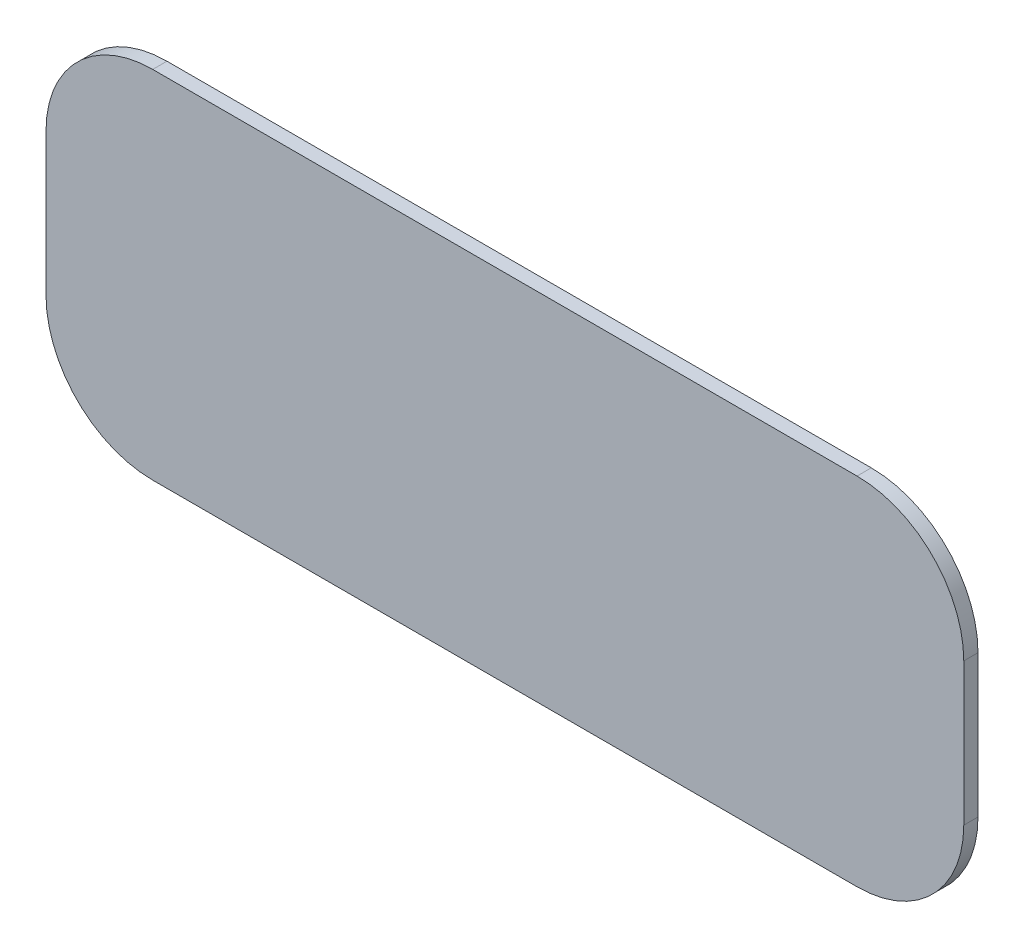
ISO-10303-21;
HEADER;
FILE_DESCRIPTION(('STEP AP214'),'2;1');
FILE_NAME('part.step','',(''),(''),'','','');
FILE_SCHEMA(('AUTOMOTIVE_DESIGN { 1 0 10303 214 1 1 1 1 }'));
ENDSEC;
DATA;
#1=APPLICATION_CONTEXT('core data for automotive mechanical design processes');
#2=APPLICATION_PROTOCOL_DEFINITION('international standard','automotive_design',2000,#1);
#3=PRODUCT_CONTEXT('',#1,'mechanical');
#4=PRODUCT('Part','Part','',(#3));
#5=PRODUCT_RELATED_PRODUCT_CATEGORY('part','',(#4));
#6=PRODUCT_DEFINITION_FORMATION('','',#4);
#7=PRODUCT_DEFINITION_CONTEXT('part definition',#1,'design');
#8=PRODUCT_DEFINITION('design','',#6,#7);
#9=PRODUCT_DEFINITION_SHAPE('','',#8);
#10=(LENGTH_UNIT() NAMED_UNIT(*) SI_UNIT(.MILLI.,.METRE.));
#11=(NAMED_UNIT(*) PLANE_ANGLE_UNIT() SI_UNIT($,.RADIAN.));
#12=(NAMED_UNIT(*) SI_UNIT($,.STERADIAN.) SOLID_ANGLE_UNIT());
#13=UNCERTAINTY_MEASURE_WITH_UNIT(LENGTH_MEASURE(1.E-05),#10,'distance_accuracy_value','');
#14=(GEOMETRIC_REPRESENTATION_CONTEXT(3) GLOBAL_UNCERTAINTY_ASSIGNED_CONTEXT((#13)) GLOBAL_UNIT_ASSIGNED_CONTEXT((#10,
#11,#12)) REPRESENTATION_CONTEXT('',''));
#15=CARTESIAN_POINT('',(0.,0.,0.));
#16=DIRECTION('',(0.,0.,1.));
#17=DIRECTION('',(1.,0.,0.));
#18=AXIS2_PLACEMENT_3D('',#15,#16,#17);
#19=CARTESIAN_POINT('',(0.,0.,2.));
#20=DIRECTION('',(-1.,0.,0.));
#21=DIRECTION('',(0.,-1.,0.));
#22=AXIS2_PLACEMENT_3D('',#19,#20,#21);
#23=PLANE('',#22);
#24=DIRECTION('',(0.,1.,0.));
#25=VECTOR('',#24,1.);
#26=CARTESIAN_POINT('',(0.,0.,2.));
#27=LINE('',#26,#25);
#28=CARTESIAN_POINT('',(0.,15.,2.));
#29=VERTEX_POINT('',#28);
#30=CARTESIAN_POINT('',(0.,35.,2.));
#31=VERTEX_POINT('',#30);
#32=EDGE_CURVE('E128',#29,#31,#27,.T.);
#33=ORIENTED_EDGE('',*,*,#32,.F.);
#34=DIRECTION('',(0.,0.,-1.));
#35=VECTOR('',#34,1.);
#36=CARTESIAN_POINT('',(0.,15.,2.));
#37=LINE('',#36,#35);
#38=CARTESIAN_POINT('',(0.,15.,0.));
#39=VERTEX_POINT('',#38);
#40=EDGE_CURVE('E154',#29,#39,#37,.T.);
#41=ORIENTED_EDGE('',*,*,#40,.T.);
#42=DIRECTION('',(0.,1.,0.));
#43=VECTOR('',#42,1.);
#44=CARTESIAN_POINT('',(0.,0.,0.));
#45=LINE('',#44,#43);
#46=CARTESIAN_POINT('',(0.,35.,0.));
#47=VERTEX_POINT('',#46);
#48=EDGE_CURVE('E160',#39,#47,#45,.T.);
#49=ORIENTED_EDGE('',*,*,#48,.T.);
#50=DIRECTION('',(0.,0.,-1.));
#51=VECTOR('',#50,1.);
#52=CARTESIAN_POINT('',(0.,35.,2.));
#53=LINE('',#52,#51);
#54=EDGE_CURVE('E152',#47,#31,#53,.F.);
#55=ORIENTED_EDGE('',*,*,#54,.T.);
#56=EDGE_LOOP('',(#33,#41,#49,#55));
#57=FACE_BOUND('',#56,.T.);
#58=ADVANCED_FACE('F36',(#57),#23,.F.);
#59=CARTESIAN_POINT('',(0.,50.,2.));
#60=DIRECTION('',(0.,-1.,0.));
#61=DIRECTION('',(1.,0.,0.));
#62=AXIS2_PLACEMENT_3D('',#59,#60,#61);
#63=PLANE('',#62);
#64=DIRECTION('',(-1.,0.,0.));
#65=VECTOR('',#64,1.);
#66=CARTESIAN_POINT('',(0.,50.,2.));
#67=LINE('',#66,#65);
#68=CARTESIAN_POINT('',(-15.,50.,2.));
#69=VERTEX_POINT('',#68);
#70=CARTESIAN_POINT('',(-114.,50.,2.));
#71=VERTEX_POINT('',#70);
#72=EDGE_CURVE('E131',#69,#71,#67,.T.);
#73=ORIENTED_EDGE('',*,*,#72,.F.);
#74=DIRECTION('',(0.,0.,-1.));
#75=VECTOR('',#74,1.);
#76=CARTESIAN_POINT('',(-15.,50.,2.));
#77=LINE('',#76,#75);
#78=CARTESIAN_POINT('',(-15.,50.,0.));
#79=VERTEX_POINT('',#78);
#80=EDGE_CURVE('E11',#69,#79,#77,.T.);
#81=ORIENTED_EDGE('',*,*,#80,.T.);
#82=DIRECTION('',(-1.,0.,0.));
#83=VECTOR('',#82,1.);
#84=CARTESIAN_POINT('',(0.,50.,0.));
#85=LINE('',#84,#83);
#86=CARTESIAN_POINT('',(-114.,50.,0.));
#87=VERTEX_POINT('',#86);
#88=EDGE_CURVE('E133',#79,#87,#85,.T.);
#89=ORIENTED_EDGE('',*,*,#88,.T.);
#90=DIRECTION('',(0.,0.,-1.));
#91=VECTOR('',#90,1.);
#92=CARTESIAN_POINT('',(-114.,50.,2.));
#93=LINE('',#92,#91);
#94=EDGE_CURVE('E44',#87,#71,#93,.F.);
#95=ORIENTED_EDGE('',*,*,#94,.T.);
#96=EDGE_LOOP('',(#73,#81,#89,#95));
#97=FACE_BOUND('',#96,.T.);
#98=ADVANCED_FACE('F179',(#97),#63,.F.);
#99=CARTESIAN_POINT('',(-129.,0.,2.));
#100=DIRECTION('',(1.,0.,0.));
#101=DIRECTION('',(0.,0.,-1.));
#102=AXIS2_PLACEMENT_3D('',#99,#100,#101);
#103=PLANE('',#102);
#104=DIRECTION('',(0.,-1.,0.));
#105=VECTOR('',#104,1.);
#106=CARTESIAN_POINT('',(-129.,0.,0.));
#107=LINE('',#106,#105);
#108=CARTESIAN_POINT('',(-129.,35.,0.));
#109=VERTEX_POINT('',#108);
#110=CARTESIAN_POINT('',(-129.,15.,0.));
#111=VERTEX_POINT('',#110);
#112=EDGE_CURVE('E129',#109,#111,#107,.T.);
#113=ORIENTED_EDGE('',*,*,#112,.T.);
#114=DIRECTION('',(0.,0.,-1.));
#115=VECTOR('',#114,1.);
#116=CARTESIAN_POINT('',(-129.,15.,2.));
#117=LINE('',#116,#115);
#118=CARTESIAN_POINT('',(-129.,15.,2.));
#119=VERTEX_POINT('',#118);
#120=EDGE_CURVE('E107',#111,#119,#117,.F.);
#121=ORIENTED_EDGE('',*,*,#120,.T.);
#122=DIRECTION('',(0.,-1.,0.));
#123=VECTOR('',#122,1.);
#124=CARTESIAN_POINT('',(-129.,0.,2.));
#125=LINE('',#124,#123);
#126=CARTESIAN_POINT('',(-129.,35.,2.));
#127=VERTEX_POINT('',#126);
#128=EDGE_CURVE('E168',#127,#119,#125,.T.);
#129=ORIENTED_EDGE('',*,*,#128,.F.);
#130=DIRECTION('',(0.,0.,-1.));
#131=VECTOR('',#130,1.);
#132=CARTESIAN_POINT('',(-129.,35.,2.));
#133=LINE('',#132,#131);
#134=EDGE_CURVE('E112',#127,#109,#133,.T.);
#135=ORIENTED_EDGE('',*,*,#134,.T.);
#136=EDGE_LOOP('',(#113,#121,#129,#135));
#137=FACE_BOUND('',#136,.T.);
#138=ADVANCED_FACE('F178',(#137),#103,.F.);
#139=CARTESIAN_POINT('',(0.,0.,2.));
#140=DIRECTION('',(0.,1.,0.));
#141=DIRECTION('',(0.,0.,1.));
#142=AXIS2_PLACEMENT_3D('',#139,#140,#141);
#143=PLANE('',#142);
#144=DIRECTION('',(1.,0.,0.));
#145=VECTOR('',#144,1.);
#146=CARTESIAN_POINT('',(0.,0.,2.));
#147=LINE('',#146,#145);
#148=CARTESIAN_POINT('',(-114.,0.,2.));
#149=VERTEX_POINT('',#148);
#150=CARTESIAN_POINT('',(-15.,0.,2.));
#151=VERTEX_POINT('',#150);
#152=EDGE_CURVE('E122',#149,#151,#147,.T.);
#153=ORIENTED_EDGE('',*,*,#152,.F.);
#154=DIRECTION('',(0.,0.,-1.));
#155=VECTOR('',#154,1.);
#156=CARTESIAN_POINT('',(-114.,0.,2.));
#157=LINE('',#156,#155);
#158=CARTESIAN_POINT('',(-114.,0.,0.));
#159=VERTEX_POINT('',#158);
#160=EDGE_CURVE('E106',#149,#159,#157,.T.);
#161=ORIENTED_EDGE('',*,*,#160,.T.);
#162=DIRECTION('',(1.,0.,0.));
#163=VECTOR('',#162,1.);
#164=CARTESIAN_POINT('',(0.,0.,0.));
#165=LINE('',#164,#163);
#166=CARTESIAN_POINT('',(-15.,0.,0.));
#167=VERTEX_POINT('',#166);
#168=EDGE_CURVE('E119',#159,#167,#165,.T.);
#169=ORIENTED_EDGE('',*,*,#168,.T.);
#170=DIRECTION('',(0.,0.,-1.));
#171=VECTOR('',#170,1.);
#172=CARTESIAN_POINT('',(-15.,0.,2.));
#173=LINE('',#172,#171);
#174=EDGE_CURVE('E124',#167,#151,#173,.F.);
#175=ORIENTED_EDGE('',*,*,#174,.T.);
#176=EDGE_LOOP('',(#153,#161,#169,#175));
#177=FACE_BOUND('',#176,.T.);
#178=ADVANCED_FACE('F118',(#177),#143,.F.);
#179=CARTESIAN_POINT('',(0.,0.,2.));
#180=DIRECTION('',(0.,0.,1.));
#181=DIRECTION('',(1.,0.,0.));
#182=AXIS2_PLACEMENT_3D('',#179,#180,#181);
#183=PLANE('',#182);
#184=ORIENTED_EDGE('',*,*,#128,.T.);
#185=CARTESIAN_POINT('',(-114.,15.,2.));
#186=DIRECTION('',(0.,0.,1.));
#187=DIRECTION('',(1.,0.,0.));
#188=AXIS2_PLACEMENT_3D('',#185,#186,#187);
#189=CIRCLE('',#188,15.);
#190=EDGE_CURVE('E150',#119,#149,#189,.T.);
#191=ORIENTED_EDGE('',*,*,#190,.T.);
#192=ORIENTED_EDGE('',*,*,#152,.T.);
#193=CARTESIAN_POINT('',(-15.,15.,2.));
#194=DIRECTION('',(0.,0.,1.));
#195=DIRECTION('',(1.,0.,0.));
#196=AXIS2_PLACEMENT_3D('',#193,#194,#195);
#197=CIRCLE('',#196,15.);
#198=EDGE_CURVE('E148',#151,#29,#197,.T.);
#199=ORIENTED_EDGE('',*,*,#198,.T.);
#200=ORIENTED_EDGE('',*,*,#32,.T.);
#201=CARTESIAN_POINT('',(-15.,35.,2.));
#202=DIRECTION('',(0.,0.,1.));
#203=DIRECTION('',(1.,0.,0.));
#204=AXIS2_PLACEMENT_3D('',#201,#202,#203);
#205=CIRCLE('',#204,15.);
#206=EDGE_CURVE('E57',#31,#69,#205,.T.);
#207=ORIENTED_EDGE('',*,*,#206,.T.);
#208=ORIENTED_EDGE('',*,*,#72,.T.);
#209=CARTESIAN_POINT('',(-114.,35.,2.));
#210=DIRECTION('',(0.,0.,1.));
#211=DIRECTION('',(1.,0.,0.));
#212=AXIS2_PLACEMENT_3D('',#209,#210,#211);
#213=CIRCLE('',#212,15.);
#214=EDGE_CURVE('E145',#71,#127,#213,.T.);
#215=ORIENTED_EDGE('',*,*,#214,.T.);
#216=EDGE_LOOP('',(#184,#191,#192,#199,#200,#207,#208,#215));
#217=FACE_BOUND('',#216,.T.);
#218=ADVANCED_FACE('F172',(#217),#183,.T.);
#219=CARTESIAN_POINT('',(0.,0.,0.));
#220=DIRECTION('',(0.,0.,1.));
#221=DIRECTION('',(1.,0.,0.));
#222=AXIS2_PLACEMENT_3D('',#219,#220,#221);
#223=PLANE('',#222);
#224=ORIENTED_EDGE('',*,*,#168,.F.);
#225=CARTESIAN_POINT('',(-114.,15.,0.));
#226=DIRECTION('',(0.,0.,1.));
#227=DIRECTION('',(1.,0.,0.));
#228=AXIS2_PLACEMENT_3D('',#225,#226,#227);
#229=CIRCLE('',#228,15.);
#230=EDGE_CURVE('E102',#159,#111,#229,.F.);
#231=ORIENTED_EDGE('',*,*,#230,.T.);
#232=ORIENTED_EDGE('',*,*,#112,.F.);
#233=CARTESIAN_POINT('',(-114.,35.,0.));
#234=DIRECTION('',(0.,0.,1.));
#235=DIRECTION('',(1.,0.,0.));
#236=AXIS2_PLACEMENT_3D('',#233,#234,#235);
#237=CIRCLE('',#236,15.);
#238=EDGE_CURVE('E123',#109,#87,#237,.F.);
#239=ORIENTED_EDGE('',*,*,#238,.T.);
#240=ORIENTED_EDGE('',*,*,#88,.F.);
#241=CARTESIAN_POINT('',(-15.,35.,0.));
#242=DIRECTION('',(0.,0.,1.));
#243=DIRECTION('',(1.,0.,0.));
#244=AXIS2_PLACEMENT_3D('',#241,#242,#243);
#245=CIRCLE('',#244,15.);
#246=EDGE_CURVE('E139',#79,#47,#245,.F.);
#247=ORIENTED_EDGE('',*,*,#246,.T.);
#248=ORIENTED_EDGE('',*,*,#48,.F.);
#249=CARTESIAN_POINT('',(-15.,15.,0.));
#250=DIRECTION('',(0.,0.,1.));
#251=DIRECTION('',(1.,0.,0.));
#252=AXIS2_PLACEMENT_3D('',#249,#250,#251);
#253=CIRCLE('',#252,15.);
#254=EDGE_CURVE('E113',#39,#167,#253,.F.);
#255=ORIENTED_EDGE('',*,*,#254,.T.);
#256=EDGE_LOOP('',(#224,#231,#232,#239,#240,#247,#248,#255));
#257=FACE_BOUND('',#256,.T.);
#258=ADVANCED_FACE('F126',(#257),#223,.F.);
#259=CARTESIAN_POINT('',(-114.,15.,2.));
#260=DIRECTION('',(0.,0.,-1.));
#261=DIRECTION('',(-1.,0.,0.));
#262=AXIS2_PLACEMENT_3D('',#259,#260,#261);
#263=CYLINDRICAL_SURFACE('',#262,15.);
#264=ORIENTED_EDGE('',*,*,#190,.F.);
#265=ORIENTED_EDGE('',*,*,#120,.F.);
#266=ORIENTED_EDGE('',*,*,#230,.F.);
#267=ORIENTED_EDGE('',*,*,#160,.F.);
#268=EDGE_LOOP('',(#264,#265,#266,#267));
#269=FACE_BOUND('',#268,.T.);
#270=ADVANCED_FACE('F105',(#269),#263,.T.);
#271=CARTESIAN_POINT('',(-15.,15.,2.));
#272=DIRECTION('',(0.,0.,-1.));
#273=DIRECTION('',(-1.,0.,0.));
#274=AXIS2_PLACEMENT_3D('',#271,#272,#273);
#275=CYLINDRICAL_SURFACE('',#274,15.);
#276=ORIENTED_EDGE('',*,*,#198,.F.);
#277=ORIENTED_EDGE('',*,*,#174,.F.);
#278=ORIENTED_EDGE('',*,*,#254,.F.);
#279=ORIENTED_EDGE('',*,*,#40,.F.);
#280=EDGE_LOOP('',(#276,#277,#278,#279));
#281=FACE_BOUND('',#280,.T.);
#282=ADVANCED_FACE('F182',(#281),#275,.T.);
#283=CARTESIAN_POINT('',(-15.,35.,2.));
#284=DIRECTION('',(0.,0.,-1.));
#285=DIRECTION('',(-1.,0.,0.));
#286=AXIS2_PLACEMENT_3D('',#283,#284,#285);
#287=CYLINDRICAL_SURFACE('',#286,15.);
#288=ORIENTED_EDGE('',*,*,#206,.F.);
#289=ORIENTED_EDGE('',*,*,#54,.F.);
#290=ORIENTED_EDGE('',*,*,#246,.F.);
#291=ORIENTED_EDGE('',*,*,#80,.F.);
#292=EDGE_LOOP('',(#288,#289,#290,#291));
#293=FACE_BOUND('',#292,.T.);
#294=ADVANCED_FACE('F181',(#293),#287,.T.);
#295=CARTESIAN_POINT('',(-114.,35.,2.));
#296=DIRECTION('',(0.,0.,-1.));
#297=DIRECTION('',(-1.,0.,0.));
#298=AXIS2_PLACEMENT_3D('',#295,#296,#297);
#299=CYLINDRICAL_SURFACE('',#298,15.);
#300=ORIENTED_EDGE('',*,*,#214,.F.);
#301=ORIENTED_EDGE('',*,*,#94,.F.);
#302=ORIENTED_EDGE('',*,*,#238,.F.);
#303=ORIENTED_EDGE('',*,*,#134,.F.);
#304=EDGE_LOOP('',(#300,#301,#302,#303));
#305=FACE_BOUND('',#304,.T.);
#306=ADVANCED_FACE('F38',(#305),#299,.T.);
#307=CLOSED_SHELL('',(#58,#98,#138,#178,#218,#258,#270,#282,#294,#306));
#308=MANIFOLD_SOLID_BREP('B2',#307);
#309=ADVANCED_BREP_SHAPE_REPRESENTATION('',(#18,#308),#14);
#310=SHAPE_DEFINITION_REPRESENTATION(#9,#309);
ENDSEC;
END-ISO-10303-21;
